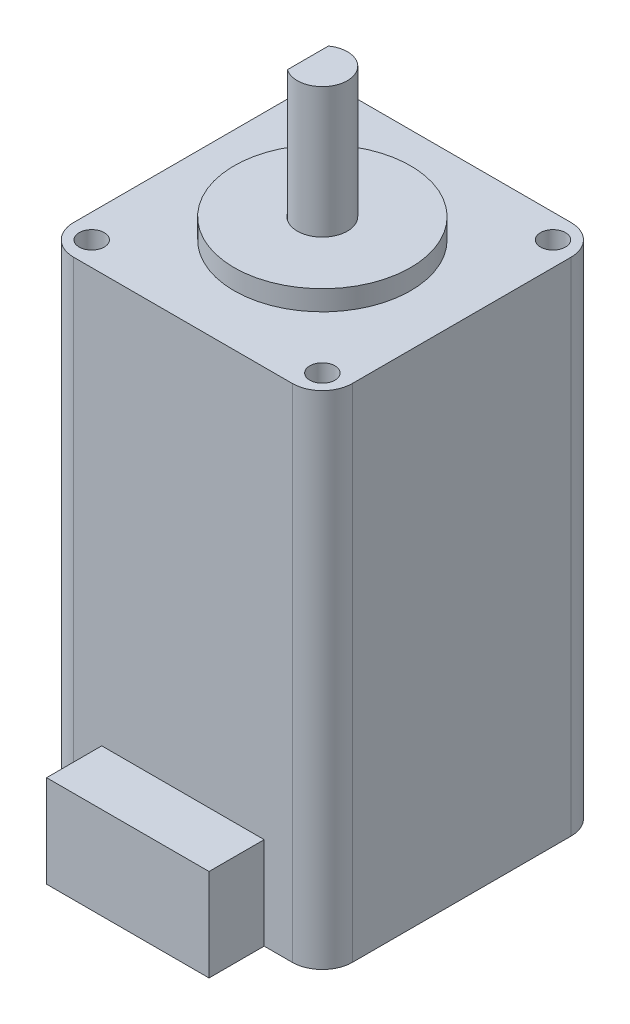
ISO-10303-21;
HEADER;
FILE_DESCRIPTION(('STEP AP214'),'2;1');
FILE_NAME('part.step','',(''),(''),'','','');
FILE_SCHEMA(('AUTOMOTIVE_DESIGN { 1 0 10303 214 1 1 1 1 }'));
ENDSEC;
DATA;
#1=APPLICATION_CONTEXT('core data for automotive mechanical design processes');
#2=APPLICATION_PROTOCOL_DEFINITION('international standard','automotive_design',2000,#1);
#3=PRODUCT_CONTEXT('',#1,'mechanical');
#4=PRODUCT('Part','Part','',(#3));
#5=PRODUCT_RELATED_PRODUCT_CATEGORY('part','',(#4));
#6=PRODUCT_DEFINITION_FORMATION('','',#4);
#7=PRODUCT_DEFINITION_CONTEXT('part definition',#1,'design');
#8=PRODUCT_DEFINITION('design','',#6,#7);
#9=PRODUCT_DEFINITION_SHAPE('','',#8);
#10=(LENGTH_UNIT() NAMED_UNIT(*) SI_UNIT(.MILLI.,.METRE.));
#11=(NAMED_UNIT(*) PLANE_ANGLE_UNIT() SI_UNIT($,.RADIAN.));
#12=(NAMED_UNIT(*) SI_UNIT($,.STERADIAN.) SOLID_ANGLE_UNIT());
#13=UNCERTAINTY_MEASURE_WITH_UNIT(LENGTH_MEASURE(1.E-05),#10,'distance_accuracy_value','');
#14=(GEOMETRIC_REPRESENTATION_CONTEXT(3) GLOBAL_UNCERTAINTY_ASSIGNED_CONTEXT((#13)) GLOBAL_UNIT_ASSIGNED_CONTEXT((#10,
#11,#12)) REPRESENTATION_CONTEXT('',''));
#15=CARTESIAN_POINT('',(0.,0.,0.));
#16=DIRECTION('',(0.,0.,1.));
#17=DIRECTION('',(1.,0.,0.));
#18=AXIS2_PLACEMENT_3D('',#15,#16,#17);
#19=CARTESIAN_POINT('',(0.,65.,0.));
#20=DIRECTION('',(0.,-1.,0.));
#21=DIRECTION('',(0.,0.,-1.));
#22=AXIS2_PLACEMENT_3D('',#19,#20,#21);
#23=CYLINDRICAL_SURFACE('',#22,2.5);
#24=DIRECTION('',(0.,1.,0.));
#25=VECTOR('',#24,1.);
#26=CARTESIAN_POINT('',(-1.4382470003859,45.,-2.04485832415866));
#27=LINE('',#26,#25);
#28=CARTESIAN_POINT('',(-1.4382470003859,52.,-2.04485832415866));
#29=VERTEX_POINT('',#28);
#30=CARTESIAN_POINT('',(-1.4382470003859,65.,-2.04485832415866));
#31=VERTEX_POINT('',#30);
#32=EDGE_CURVE('E154',#29,#31,#27,.T.);
#33=ORIENTED_EDGE('',*,*,#32,.T.);
#34=CARTESIAN_POINT('',(0.,65.,0.));
#35=DIRECTION('',(0.,1.,0.));
#36=DIRECTION('',(0.,0.,1.));
#37=AXIS2_PLACEMENT_3D('',#34,#35,#36);
#38=CIRCLE('',#37,2.5);
#39=CARTESIAN_POINT('',(-1.4382470003859,65.,2.04485832415866));
#40=VERTEX_POINT('',#39);
#41=EDGE_CURVE('E258',#40,#31,#38,.T.);
#42=ORIENTED_EDGE('',*,*,#41,.F.);
#43=DIRECTION('',(0.,1.,0.));
#44=VECTOR('',#43,1.);
#45=CARTESIAN_POINT('',(-1.4382470003859,45.,2.04485832415866));
#46=LINE('',#45,#44);
#47=CARTESIAN_POINT('',(-1.4382470003859,52.,2.04485832415866));
#48=VERTEX_POINT('',#47);
#49=EDGE_CURVE('E57',#48,#40,#46,.T.);
#50=ORIENTED_EDGE('',*,*,#49,.F.);
#51=CARTESIAN_POINT('',(0.,52.,0.));
#52=DIRECTION('',(0.,1.,0.));
#53=DIRECTION('',(0.,0.,1.));
#54=AXIS2_PLACEMENT_3D('',#51,#52,#53);
#55=CIRCLE('',#54,2.5);
#56=EDGE_CURVE('E267',#48,#29,#55,.T.);
#57=ORIENTED_EDGE('',*,*,#56,.T.);
#58=EDGE_LOOP('',(#33,#42,#50,#57));
#59=FACE_BOUND('',#58,.T.);
#60=ADVANCED_FACE('F41',(#59),#23,.T.);
#61=CARTESIAN_POINT('',(0.,65.,0.));
#62=DIRECTION('',(0.,1.,0.));
#63=DIRECTION('',(0.,0.,1.));
#64=AXIS2_PLACEMENT_3D('',#61,#62,#63);
#65=PLANE('',#64);
#66=ORIENTED_EDGE('',*,*,#41,.T.);
#67=DIRECTION('',(0.,0.,1.));
#68=VECTOR('',#67,1.);
#69=CARTESIAN_POINT('',(-1.4382470003859,65.,0.));
#70=LINE('',#69,#68);
#71=EDGE_CURVE('E165',#31,#40,#70,.T.);
#72=ORIENTED_EDGE('',*,*,#71,.T.);
#73=EDGE_LOOP('',(#66,#72));
#74=FACE_BOUND('',#73,.T.);
#75=ADVANCED_FACE('F433',(#74),#65,.T.);
#76=CARTESIAN_POINT('',(-13.9,50.,13.9));
#77=DIRECTION('',(0.,0.,-1.));
#78=DIRECTION('',(-1.,0.,0.));
#79=AXIS2_PLACEMENT_3D('',#76,#77,#78);
#80=PLANE('',#79);
#81=DIRECTION('',(1.,0.,0.));
#82=VECTOR('',#81,1.);
#83=CARTESIAN_POINT('',(-13.9,0.,13.9));
#84=LINE('',#83,#82);
#85=CARTESIAN_POINT('',(8.1,0.,13.9));
#86=VERTEX_POINT('',#85);
#87=CARTESIAN_POINT('',(10.9,0.,13.9));
#88=VERTEX_POINT('',#87);
#89=EDGE_CURVE('E303',#86,#88,#84,.T.);
#90=ORIENTED_EDGE('',*,*,#89,.T.);
#91=DIRECTION('',(0.,-1.,0.));
#92=VECTOR('',#91,1.);
#93=CARTESIAN_POINT('',(10.9,50.,13.9));
#94=LINE('',#93,#92);
#95=CARTESIAN_POINT('',(10.9,50.,13.9));
#96=VERTEX_POINT('',#95);
#97=EDGE_CURVE('E11',#88,#96,#94,.F.);
#98=ORIENTED_EDGE('',*,*,#97,.T.);
#99=DIRECTION('',(1.,0.,0.));
#100=VECTOR('',#99,1.);
#101=CARTESIAN_POINT('',(-13.9,50.,13.9));
#102=LINE('',#101,#100);
#103=CARTESIAN_POINT('',(-10.9,50.,13.9));
#104=VERTEX_POINT('',#103);
#105=EDGE_CURVE('E276',#104,#96,#102,.T.);
#106=ORIENTED_EDGE('',*,*,#105,.F.);
#107=DIRECTION('',(0.,-1.,0.));
#108=VECTOR('',#107,1.);
#109=CARTESIAN_POINT('',(-10.9,50.,13.9));
#110=LINE('',#109,#108);
#111=CARTESIAN_POINT('',(-10.9,0.,13.9));
#112=VERTEX_POINT('',#111);
#113=EDGE_CURVE('E50',#104,#112,#110,.T.);
#114=ORIENTED_EDGE('',*,*,#113,.T.);
#115=CARTESIAN_POINT('',(-8.1,0.,13.9));
#116=VERTEX_POINT('',#115);
#117=EDGE_CURVE('E282',#112,#116,#84,.T.);
#118=ORIENTED_EDGE('',*,*,#117,.T.);
#119=DIRECTION('',(0.,-1.,0.));
#120=VECTOR('',#119,1.);
#121=CARTESIAN_POINT('',(-8.1,9.2,13.9));
#122=LINE('',#121,#120);
#123=CARTESIAN_POINT('',(-8.1,9.2,13.9));
#124=VERTEX_POINT('',#123);
#125=EDGE_CURVE('E223',#124,#116,#122,.T.);
#126=ORIENTED_EDGE('',*,*,#125,.F.);
#127=DIRECTION('',(-1.,0.,0.));
#128=VECTOR('',#127,1.);
#129=CARTESIAN_POINT('',(-8.1,9.2,13.9));
#130=LINE('',#129,#128);
#131=CARTESIAN_POINT('',(8.1,9.2,13.9));
#132=VERTEX_POINT('',#131);
#133=EDGE_CURVE('E236',#132,#124,#130,.T.);
#134=ORIENTED_EDGE('',*,*,#133,.F.);
#135=DIRECTION('',(0.,1.,0.));
#136=VECTOR('',#135,1.);
#137=CARTESIAN_POINT('',(8.1,9.2,13.9));
#138=LINE('',#137,#136);
#139=EDGE_CURVE('E214',#86,#132,#138,.T.);
#140=ORIENTED_EDGE('',*,*,#139,.F.);
#141=EDGE_LOOP('',(#90,#98,#106,#114,#118,#126,#134,#140));
#142=FACE_BOUND('',#141,.T.);
#143=ADVANCED_FACE('F353',(#142),#80,.F.);
#144=CARTESIAN_POINT('',(13.9,50.,-13.9));
#145=DIRECTION('',(-1.,0.,0.));
#146=DIRECTION('',(0.,0.,1.));
#147=AXIS2_PLACEMENT_3D('',#144,#145,#146);
#148=PLANE('',#147);
#149=DIRECTION('',(0.,0.,-1.));
#150=VECTOR('',#149,1.);
#151=CARTESIAN_POINT('',(13.9,0.,-13.9));
#152=LINE('',#151,#150);
#153=CARTESIAN_POINT('',(13.9,0.,10.9));
#154=VERTEX_POINT('',#153);
#155=CARTESIAN_POINT('',(13.9,0.,-10.9));
#156=VERTEX_POINT('',#155);
#157=EDGE_CURVE('E271',#154,#156,#152,.T.);
#158=ORIENTED_EDGE('',*,*,#157,.T.);
#159=DIRECTION('',(0.,-1.,0.));
#160=VECTOR('',#159,1.);
#161=CARTESIAN_POINT('',(13.9,50.,-10.9));
#162=LINE('',#161,#160);
#163=CARTESIAN_POINT('',(13.9,50.,-10.9));
#164=VERTEX_POINT('',#163);
#165=EDGE_CURVE('E328',#156,#164,#162,.F.);
#166=ORIENTED_EDGE('',*,*,#165,.T.);
#167=DIRECTION('',(0.,0.,-1.));
#168=VECTOR('',#167,1.);
#169=CARTESIAN_POINT('',(13.9,50.,-13.9));
#170=LINE('',#169,#168);
#171=CARTESIAN_POINT('',(13.9,50.,10.9));
#172=VERTEX_POINT('',#171);
#173=EDGE_CURVE('E277',#172,#164,#170,.T.);
#174=ORIENTED_EDGE('',*,*,#173,.F.);
#175=DIRECTION('',(0.,-1.,0.));
#176=VECTOR('',#175,1.);
#177=CARTESIAN_POINT('',(13.9,50.,10.9));
#178=LINE('',#177,#176);
#179=EDGE_CURVE('E324',#172,#154,#178,.T.);
#180=ORIENTED_EDGE('',*,*,#179,.T.);
#181=EDGE_LOOP('',(#158,#166,#174,#180));
#182=FACE_BOUND('',#181,.T.);
#183=ADVANCED_FACE('F447',(#182),#148,.F.);
#184=CARTESIAN_POINT('',(-13.9,50.,-13.9));
#185=DIRECTION('',(0.,0.,1.));
#186=DIRECTION('',(1.,0.,0.));
#187=AXIS2_PLACEMENT_3D('',#184,#185,#186);
#188=PLANE('',#187);
#189=DIRECTION('',(-1.,0.,0.));
#190=VECTOR('',#189,1.);
#191=CARTESIAN_POINT('',(-13.9,50.,-13.9));
#192=LINE('',#191,#190);
#193=CARTESIAN_POINT('',(10.9,50.,-13.9));
#194=VERTEX_POINT('',#193);
#195=CARTESIAN_POINT('',(-10.9,50.,-13.9));
#196=VERTEX_POINT('',#195);
#197=EDGE_CURVE('E281',#194,#196,#192,.T.);
#198=ORIENTED_EDGE('',*,*,#197,.F.);
#199=DIRECTION('',(0.,-1.,0.));
#200=VECTOR('',#199,1.);
#201=CARTESIAN_POINT('',(10.9,50.,-13.9));
#202=LINE('',#201,#200);
#203=CARTESIAN_POINT('',(10.9,0.,-13.9));
#204=VERTEX_POINT('',#203);
#205=EDGE_CURVE('E308',#194,#204,#202,.T.);
#206=ORIENTED_EDGE('',*,*,#205,.T.);
#207=DIRECTION('',(-1.,0.,0.));
#208=VECTOR('',#207,1.);
#209=CARTESIAN_POINT('',(-13.9,0.,-13.9));
#210=LINE('',#209,#208);
#211=CARTESIAN_POINT('',(-10.9,0.,-13.9));
#212=VERTEX_POINT('',#211);
#213=EDGE_CURVE('E295',#204,#212,#210,.T.);
#214=ORIENTED_EDGE('',*,*,#213,.T.);
#215=DIRECTION('',(0.,-1.,0.));
#216=VECTOR('',#215,1.);
#217=CARTESIAN_POINT('',(-10.9,50.,-13.9));
#218=LINE('',#217,#216);
#219=EDGE_CURVE('E266',#212,#196,#218,.F.);
#220=ORIENTED_EDGE('',*,*,#219,.T.);
#221=EDGE_LOOP('',(#198,#206,#214,#220));
#222=FACE_BOUND('',#221,.T.);
#223=ADVANCED_FACE('F412',(#222),#188,.F.);
#224=CARTESIAN_POINT('',(-13.9,50.,-13.9));
#225=DIRECTION('',(1.,0.,0.));
#226=DIRECTION('',(0.,0.,-1.));
#227=AXIS2_PLACEMENT_3D('',#224,#225,#226);
#228=PLANE('',#227);
#229=DIRECTION('',(0.,0.,1.));
#230=VECTOR('',#229,1.);
#231=CARTESIAN_POINT('',(-13.9,50.,-13.9));
#232=LINE('',#231,#230);
#233=CARTESIAN_POINT('',(-13.9,50.,-10.9));
#234=VERTEX_POINT('',#233);
#235=CARTESIAN_POINT('',(-13.9,50.,10.9));
#236=VERTEX_POINT('',#235);
#237=EDGE_CURVE('E286',#234,#236,#232,.T.);
#238=ORIENTED_EDGE('',*,*,#237,.F.);
#239=DIRECTION('',(0.,-1.,0.));
#240=VECTOR('',#239,1.);
#241=CARTESIAN_POINT('',(-13.9,50.,-10.9));
#242=LINE('',#241,#240);
#243=CARTESIAN_POINT('',(-13.9,0.,-10.9));
#244=VERTEX_POINT('',#243);
#245=EDGE_CURVE('E346',#234,#244,#242,.T.);
#246=ORIENTED_EDGE('',*,*,#245,.T.);
#247=DIRECTION('',(0.,0.,1.));
#248=VECTOR('',#247,1.);
#249=CARTESIAN_POINT('',(-13.9,0.,-13.9));
#250=LINE('',#249,#248);
#251=CARTESIAN_POINT('',(-13.9,0.,10.9));
#252=VERTEX_POINT('',#251);
#253=EDGE_CURVE('E299',#244,#252,#250,.T.);
#254=ORIENTED_EDGE('',*,*,#253,.T.);
#255=DIRECTION('',(0.,-1.,0.));
#256=VECTOR('',#255,1.);
#257=CARTESIAN_POINT('',(-13.9,50.,10.9));
#258=LINE('',#257,#256);
#259=EDGE_CURVE('E343',#252,#236,#258,.F.);
#260=ORIENTED_EDGE('',*,*,#259,.T.);
#261=EDGE_LOOP('',(#238,#246,#254,#260));
#262=FACE_BOUND('',#261,.T.);
#263=ADVANCED_FACE('F398',(#262),#228,.F.);
#264=CARTESIAN_POINT('',(0.,50.,0.));
#265=DIRECTION('',(0.,1.,0.));
#266=DIRECTION('',(0.,0.,1.));
#267=AXIS2_PLACEMENT_3D('',#264,#265,#266);
#268=PLANE('',#267);
#269=CARTESIAN_POINT('',(-11.4999999999988,50.,11.5000000000004));
#270=DIRECTION('',(0.,1.,0.));
#271=DIRECTION('',(0.,0.,1.));
#272=AXIS2_PLACEMENT_3D('',#269,#270,#271);
#273=CIRCLE('',#272,1.25);
#274=CARTESIAN_POINT('',(-11.4999999999988,50.,12.7500000000004));
#275=VERTEX_POINT('',#274);
#276=EDGE_CURVE('E182',#275,#275,#273,.T.);
#277=ORIENTED_EDGE('',*,*,#276,.F.);
#278=EDGE_LOOP('',(#277));
#279=FACE_BOUND('',#278,.T.);
#280=CARTESIAN_POINT('',(11.5000000000012,50.,11.4999999999996));
#281=DIRECTION('',(0.,1.,0.));
#282=DIRECTION('',(0.,0.,1.));
#283=AXIS2_PLACEMENT_3D('',#280,#281,#282);
#284=CIRCLE('',#283,1.25);
#285=CARTESIAN_POINT('',(11.5000000000012,50.,12.7499999999996));
#286=VERTEX_POINT('',#285);
#287=EDGE_CURVE('E199',#286,#286,#284,.T.);
#288=ORIENTED_EDGE('',*,*,#287,.F.);
#289=EDGE_LOOP('',(#288));
#290=FACE_BOUND('',#289,.T.);
#291=CARTESIAN_POINT('',(11.5000000000004,50.,-11.5000000000004));
#292=DIRECTION('',(0.,1.,0.));
#293=DIRECTION('',(0.,0.,1.));
#294=AXIS2_PLACEMENT_3D('',#291,#292,#293);
#295=CIRCLE('',#294,1.25);
#296=CARTESIAN_POINT('',(11.5000000000004,50.,-10.2500000000004));
#297=VERTEX_POINT('',#296);
#298=EDGE_CURVE('E191',#297,#297,#295,.T.);
#299=ORIENTED_EDGE('',*,*,#298,.F.);
#300=EDGE_LOOP('',(#299));
#301=FACE_BOUND('',#300,.T.);
#302=CARTESIAN_POINT('',(-11.4999999999996,50.,-11.4999999999996));
#303=DIRECTION('',(0.,1.,0.));
#304=DIRECTION('',(0.,0.,1.));
#305=AXIS2_PLACEMENT_3D('',#302,#303,#304);
#306=CIRCLE('',#305,1.25);
#307=CARTESIAN_POINT('',(-11.4999999999996,50.,-10.2499999999996));
#308=VERTEX_POINT('',#307);
#309=EDGE_CURVE('E190',#308,#308,#306,.T.);
#310=ORIENTED_EDGE('',*,*,#309,.F.);
#311=EDGE_LOOP('',(#310));
#312=FACE_BOUND('',#311,.T.);
#313=CARTESIAN_POINT('',(0.,50.,0.));
#314=DIRECTION('',(0.,1.,0.));
#315=DIRECTION('',(0.,0.,1.));
#316=AXIS2_PLACEMENT_3D('',#313,#314,#315);
#317=CIRCLE('',#316,8.8);
#318=CARTESIAN_POINT('',(0.,50.,8.8));
#319=VERTEX_POINT('',#318);
#320=EDGE_CURVE('E272',#319,#319,#317,.T.);
#321=ORIENTED_EDGE('',*,*,#320,.F.);
#322=EDGE_LOOP('',(#321));
#323=FACE_BOUND('',#322,.T.);
#324=ORIENTED_EDGE('',*,*,#173,.T.);
#325=CARTESIAN_POINT('',(10.9,50.,-10.9));
#326=DIRECTION('',(0.,1.,0.));
#327=DIRECTION('',(0.,0.,1.));
#328=AXIS2_PLACEMENT_3D('',#325,#326,#327);
#329=CIRCLE('',#328,3.);
#330=EDGE_CURVE('E340',#164,#194,#329,.T.);
#331=ORIENTED_EDGE('',*,*,#330,.T.);
#332=ORIENTED_EDGE('',*,*,#197,.T.);
#333=CARTESIAN_POINT('',(-10.9,50.,-10.9));
#334=DIRECTION('',(0.,1.,0.));
#335=DIRECTION('',(0.,0.,1.));
#336=AXIS2_PLACEMENT_3D('',#333,#334,#335);
#337=CIRCLE('',#336,3.);
#338=EDGE_CURVE('E337',#196,#234,#337,.T.);
#339=ORIENTED_EDGE('',*,*,#338,.T.);
#340=ORIENTED_EDGE('',*,*,#237,.T.);
#341=CARTESIAN_POINT('',(-10.9,50.,10.9));
#342=DIRECTION('',(0.,1.,0.));
#343=DIRECTION('',(0.,0.,1.));
#344=AXIS2_PLACEMENT_3D('',#341,#342,#343);
#345=CIRCLE('',#344,3.);
#346=EDGE_CURVE('E331',#236,#104,#345,.T.);
#347=ORIENTED_EDGE('',*,*,#346,.T.);
#348=ORIENTED_EDGE('',*,*,#105,.T.);
#349=CARTESIAN_POINT('',(10.9,50.,10.9));
#350=DIRECTION('',(0.,1.,0.));
#351=DIRECTION('',(0.,0.,1.));
#352=AXIS2_PLACEMENT_3D('',#349,#350,#351);
#353=CIRCLE('',#352,3.);
#354=EDGE_CURVE('E334',#96,#172,#353,.T.);
#355=ORIENTED_EDGE('',*,*,#354,.T.);
#356=EDGE_LOOP('',(#324,#331,#332,#339,#340,#347,#348,#355));
#357=FACE_BOUND('',#356,.T.);
#358=ADVANCED_FACE('F395',(#279,#290,#301,#312,#323,#357),#268,.T.);
#359=CARTESIAN_POINT('',(0.,0.,0.));
#360=DIRECTION('',(0.,1.,0.));
#361=DIRECTION('',(0.,0.,1.));
#362=AXIS2_PLACEMENT_3D('',#359,#360,#361);
#363=PLANE('',#362);
#364=CARTESIAN_POINT('',(0.,0.,0.));
#365=DIRECTION('',(0.,-1.,0.));
#366=DIRECTION('',(0.,0.,-1.));
#367=AXIS2_PLACEMENT_3D('',#364,#365,#366);
#368=CIRCLE('',#367,4.);
#369=CARTESIAN_POINT('',(0.,0.,-4.));
#370=VERTEX_POINT('',#369);
#371=EDGE_CURVE('E176',#370,#370,#368,.T.);
#372=ORIENTED_EDGE('',*,*,#371,.F.);
#373=EDGE_LOOP('',(#372));
#374=FACE_BOUND('',#373,.T.);
#375=ORIENTED_EDGE('',*,*,#213,.F.);
#376=CARTESIAN_POINT('',(10.9,0.,-10.9));
#377=DIRECTION('',(0.,1.,0.));
#378=DIRECTION('',(0.,0.,1.));
#379=AXIS2_PLACEMENT_3D('',#376,#377,#378);
#380=CIRCLE('',#379,3.);
#381=EDGE_CURVE('E321',#204,#156,#380,.F.);
#382=ORIENTED_EDGE('',*,*,#381,.T.);
#383=ORIENTED_EDGE('',*,*,#157,.F.);
#384=CARTESIAN_POINT('',(10.9,0.,10.9));
#385=DIRECTION('',(0.,1.,0.));
#386=DIRECTION('',(0.,0.,1.));
#387=AXIS2_PLACEMENT_3D('',#384,#385,#386);
#388=CIRCLE('',#387,3.);
#389=EDGE_CURVE('E315',#154,#88,#388,.F.);
#390=ORIENTED_EDGE('',*,*,#389,.T.);
#391=ORIENTED_EDGE('',*,*,#89,.F.);
#392=DIRECTION('',(0.,0.,-1.));
#393=VECTOR('',#392,1.);
#394=CARTESIAN_POINT('',(8.1,0.,19.4));
#395=LINE('',#394,#393);
#396=CARTESIAN_POINT('',(8.1,0.,19.4));
#397=VERTEX_POINT('',#396);
#398=EDGE_CURVE('E232',#397,#86,#395,.T.);
#399=ORIENTED_EDGE('',*,*,#398,.F.);
#400=DIRECTION('',(1.,0.,0.));
#401=VECTOR('',#400,1.);
#402=CARTESIAN_POINT('',(-8.1,0.,19.4));
#403=LINE('',#402,#401);
#404=CARTESIAN_POINT('',(-8.1,0.,19.4));
#405=VERTEX_POINT('',#404);
#406=EDGE_CURVE('E229',#405,#397,#403,.T.);
#407=ORIENTED_EDGE('',*,*,#406,.F.);
#408=DIRECTION('',(0.,0.,-1.));
#409=VECTOR('',#408,1.);
#410=CARTESIAN_POINT('',(-8.1,0.,19.4));
#411=LINE('',#410,#409);
#412=EDGE_CURVE('E246',#405,#116,#411,.T.);
#413=ORIENTED_EDGE('',*,*,#412,.T.);
#414=ORIENTED_EDGE('',*,*,#117,.F.);
#415=CARTESIAN_POINT('',(-10.9,0.,10.9));
#416=DIRECTION('',(0.,1.,0.));
#417=DIRECTION('',(0.,0.,1.));
#418=AXIS2_PLACEMENT_3D('',#415,#416,#417);
#419=CIRCLE('',#418,3.);
#420=EDGE_CURVE('E312',#112,#252,#419,.F.);
#421=ORIENTED_EDGE('',*,*,#420,.T.);
#422=ORIENTED_EDGE('',*,*,#253,.F.);
#423=CARTESIAN_POINT('',(-10.9,0.,-10.9));
#424=DIRECTION('',(0.,1.,0.));
#425=DIRECTION('',(0.,0.,1.));
#426=AXIS2_PLACEMENT_3D('',#423,#424,#425);
#427=CIRCLE('',#426,3.);
#428=EDGE_CURVE('E318',#244,#212,#427,.F.);
#429=ORIENTED_EDGE('',*,*,#428,.T.);
#430=EDGE_LOOP('',(#375,#382,#383,#390,#391,#399,#407,#413,#414,#421,#422,#429));
#431=FACE_BOUND('',#430,.T.);
#432=ADVANCED_FACE('F358',(#374,#431),#363,.F.);
#433=CARTESIAN_POINT('',(0.,52.,0.));
#434=DIRECTION('',(0.,-1.,0.));
#435=DIRECTION('',(0.,0.,-1.));
#436=AXIS2_PLACEMENT_3D('',#433,#434,#435);
#437=CYLINDRICAL_SURFACE('',#436,8.8);
#438=CARTESIAN_POINT('',(0.,52.,0.));
#439=DIRECTION('',(0.,1.,0.));
#440=DIRECTION('',(0.,0.,1.));
#441=AXIS2_PLACEMENT_3D('',#438,#439,#440);
#442=CIRCLE('',#441,8.8);
#443=CARTESIAN_POINT('',(0.,52.,8.8));
#444=VERTEX_POINT('',#443);
#445=EDGE_CURVE('E262',#444,#444,#442,.T.);
#446=ORIENTED_EDGE('',*,*,#445,.F.);
#447=EDGE_LOOP('',(#446));
#448=FACE_BOUND('',#447,.T.);
#449=ORIENTED_EDGE('',*,*,#320,.T.);
#450=EDGE_LOOP('',(#449));
#451=FACE_BOUND('',#450,.T.);
#452=ADVANCED_FACE('F386',(#448,#451),#437,.T.);
#453=CARTESIAN_POINT('',(0.,52.,0.));
#454=DIRECTION('',(0.,1.,0.));
#455=DIRECTION('',(0.,0.,1.));
#456=AXIS2_PLACEMENT_3D('',#453,#454,#455);
#457=PLANE('',#456);
#458=EDGE_CURVE('E263',#29,#48,#55,.T.);
#459=ORIENTED_EDGE('',*,*,#458,.F.);
#460=ORIENTED_EDGE('',*,*,#56,.F.);
#461=EDGE_LOOP('',(#459,#460));
#462=FACE_BOUND('',#461,.T.);
#463=ORIENTED_EDGE('',*,*,#445,.T.);
#464=EDGE_LOOP('',(#463));
#465=FACE_BOUND('',#464,.T.);
#466=ADVANCED_FACE('F383',(#462,#465),#457,.T.);
#467=CARTESIAN_POINT('',(8.1,9.2,19.4));
#468=DIRECTION('',(-1.,0.,0.));
#469=DIRECTION('',(0.,0.,1.));
#470=AXIS2_PLACEMENT_3D('',#467,#468,#469);
#471=PLANE('',#470);
#472=ORIENTED_EDGE('',*,*,#139,.T.);
#473=DIRECTION('',(0.,0.,-1.));
#474=VECTOR('',#473,1.);
#475=CARTESIAN_POINT('',(8.1,9.2,19.4));
#476=LINE('',#475,#474);
#477=CARTESIAN_POINT('',(8.1,9.2,19.4));
#478=VERTEX_POINT('',#477);
#479=EDGE_CURVE('E254',#478,#132,#476,.T.);
#480=ORIENTED_EDGE('',*,*,#479,.F.);
#481=DIRECTION('',(0.,1.,0.));
#482=VECTOR('',#481,1.);
#483=CARTESIAN_POINT('',(8.1,9.2,19.4));
#484=LINE('',#483,#482);
#485=EDGE_CURVE('E218',#397,#478,#484,.T.);
#486=ORIENTED_EDGE('',*,*,#485,.F.);
#487=ORIENTED_EDGE('',*,*,#398,.T.);
#488=EDGE_LOOP('',(#472,#480,#486,#487));
#489=FACE_BOUND('',#488,.T.);
#490=ADVANCED_FACE('F372',(#489),#471,.F.);
#491=CARTESIAN_POINT('',(-8.1,9.2,19.4));
#492=DIRECTION('',(0.,-1.,0.));
#493=DIRECTION('',(0.,0.,-1.));
#494=AXIS2_PLACEMENT_3D('',#491,#492,#493);
#495=PLANE('',#494);
#496=ORIENTED_EDGE('',*,*,#133,.T.);
#497=DIRECTION('',(0.,0.,-1.));
#498=VECTOR('',#497,1.);
#499=CARTESIAN_POINT('',(-8.1,9.2,19.4));
#500=LINE('',#499,#498);
#501=CARTESIAN_POINT('',(-8.1,9.2,19.4));
#502=VERTEX_POINT('',#501);
#503=EDGE_CURVE('E250',#502,#124,#500,.T.);
#504=ORIENTED_EDGE('',*,*,#503,.F.);
#505=DIRECTION('',(-1.,0.,0.));
#506=VECTOR('',#505,1.);
#507=CARTESIAN_POINT('',(-8.1,9.2,19.4));
#508=LINE('',#507,#506);
#509=EDGE_CURVE('E222',#478,#502,#508,.T.);
#510=ORIENTED_EDGE('',*,*,#509,.F.);
#511=ORIENTED_EDGE('',*,*,#479,.T.);
#512=EDGE_LOOP('',(#496,#504,#510,#511));
#513=FACE_BOUND('',#512,.T.);
#514=ADVANCED_FACE('F368',(#513),#495,.F.);
#515=CARTESIAN_POINT('',(-8.1,9.2,19.4));
#516=DIRECTION('',(1.,0.,0.));
#517=DIRECTION('',(0.,1.,0.));
#518=AXIS2_PLACEMENT_3D('',#515,#516,#517);
#519=PLANE('',#518);
#520=ORIENTED_EDGE('',*,*,#125,.T.);
#521=ORIENTED_EDGE('',*,*,#412,.F.);
#522=DIRECTION('',(0.,-1.,0.));
#523=VECTOR('',#522,1.);
#524=CARTESIAN_POINT('',(-8.1,9.2,19.4));
#525=LINE('',#524,#523);
#526=EDGE_CURVE('E226',#502,#405,#525,.T.);
#527=ORIENTED_EDGE('',*,*,#526,.F.);
#528=ORIENTED_EDGE('',*,*,#503,.T.);
#529=EDGE_LOOP('',(#520,#521,#527,#528));
#530=FACE_BOUND('',#529,.T.);
#531=ADVANCED_FACE('F365',(#530),#519,.F.);
#532=CARTESIAN_POINT('',(0.,0.,19.4));
#533=DIRECTION('',(0.,0.,1.));
#534=DIRECTION('',(1.,0.,0.));
#535=AXIS2_PLACEMENT_3D('',#532,#533,#534);
#536=PLANE('',#535);
#537=ORIENTED_EDGE('',*,*,#485,.T.);
#538=ORIENTED_EDGE('',*,*,#509,.T.);
#539=ORIENTED_EDGE('',*,*,#526,.T.);
#540=ORIENTED_EDGE('',*,*,#406,.T.);
#541=EDGE_LOOP('',(#537,#538,#539,#540));
#542=FACE_BOUND('',#541,.T.);
#543=ADVANCED_FACE('F594',(#542),#536,.T.);
#544=CARTESIAN_POINT('',(-11.4999999999996,45.,-11.4999999999996));
#545=DIRECTION('',(0.,1.,0.));
#546=DIRECTION('',(0.,0.,1.));
#547=AXIS2_PLACEMENT_3D('',#544,#545,#546);
#548=CYLINDRICAL_SURFACE('',#547,1.25);
#549=CARTESIAN_POINT('',(-11.4999999999996,45.,-11.4999999999996));
#550=DIRECTION('',(0.,1.,0.));
#551=DIRECTION('',(0.,0.,1.));
#552=AXIS2_PLACEMENT_3D('',#549,#550,#551);
#553=CIRCLE('',#552,1.25);
#554=CARTESIAN_POINT('',(-11.4999999999996,45.,-10.2499999999996));
#555=VERTEX_POINT('',#554);
#556=EDGE_CURVE('E210',#555,#555,#553,.T.);
#557=ORIENTED_EDGE('',*,*,#556,.F.);
#558=EDGE_LOOP('',(#557));
#559=FACE_BOUND('',#558,.T.);
#560=ORIENTED_EDGE('',*,*,#309,.T.);
#561=EDGE_LOOP('',(#560));
#562=FACE_BOUND('',#561,.T.);
#563=ADVANCED_FACE('F603',(#559,#562),#548,.F.);
#564=CARTESIAN_POINT('',(-11.4999999999996,45.,-11.4999999999996));
#565=DIRECTION('',(0.,1.,0.));
#566=DIRECTION('',(0.,0.,1.));
#567=AXIS2_PLACEMENT_3D('',#564,#565,#566);
#568=PLANE('',#567);
#569=ORIENTED_EDGE('',*,*,#556,.T.);
#570=EDGE_LOOP('',(#569));
#571=FACE_BOUND('',#570,.T.);
#572=ADVANCED_FACE('F613',(#571),#568,.T.);
#573=CARTESIAN_POINT('',(11.5000000000004,45.,-11.5000000000004));
#574=DIRECTION('',(0.,1.,0.));
#575=DIRECTION('',(0.,0.,1.));
#576=AXIS2_PLACEMENT_3D('',#573,#574,#575);
#577=CYLINDRICAL_SURFACE('',#576,1.25);
#578=CARTESIAN_POINT('',(11.5000000000004,45.,-11.5000000000004));
#579=DIRECTION('',(0.,1.,0.));
#580=DIRECTION('',(0.,0.,1.));
#581=AXIS2_PLACEMENT_3D('',#578,#579,#580);
#582=CIRCLE('',#581,1.25);
#583=CARTESIAN_POINT('',(11.5000000000004,45.,-10.2500000000004));
#584=VERTEX_POINT('',#583);
#585=EDGE_CURVE('E186',#584,#584,#582,.T.);
#586=ORIENTED_EDGE('',*,*,#585,.F.);
#587=EDGE_LOOP('',(#586));
#588=FACE_BOUND('',#587,.T.);
#589=ORIENTED_EDGE('',*,*,#298,.T.);
#590=EDGE_LOOP('',(#589));
#591=FACE_BOUND('',#590,.T.);
#592=ADVANCED_FACE('F623',(#588,#591),#577,.F.);
#593=CARTESIAN_POINT('',(11.5000000000004,45.,-11.5000000000004));
#594=DIRECTION('',(0.,1.,0.));
#595=DIRECTION('',(0.,0.,1.));
#596=AXIS2_PLACEMENT_3D('',#593,#594,#595);
#597=PLANE('',#596);
#598=ORIENTED_EDGE('',*,*,#585,.T.);
#599=EDGE_LOOP('',(#598));
#600=FACE_BOUND('',#599,.T.);
#601=ADVANCED_FACE('F633',(#600),#597,.T.);
#602=CARTESIAN_POINT('',(11.5000000000012,45.,11.4999999999996));
#603=DIRECTION('',(0.,1.,0.));
#604=DIRECTION('',(0.,0.,1.));
#605=AXIS2_PLACEMENT_3D('',#602,#603,#604);
#606=CYLINDRICAL_SURFACE('',#605,1.25);
#607=CARTESIAN_POINT('',(11.5000000000012,45.,11.4999999999996));
#608=DIRECTION('',(0.,1.,0.));
#609=DIRECTION('',(0.,0.,1.));
#610=AXIS2_PLACEMENT_3D('',#607,#608,#609);
#611=CIRCLE('',#610,1.25);
#612=CARTESIAN_POINT('',(11.5000000000012,45.,12.7499999999996));
#613=VERTEX_POINT('',#612);
#614=EDGE_CURVE('E195',#613,#613,#611,.T.);
#615=ORIENTED_EDGE('',*,*,#614,.F.);
#616=EDGE_LOOP('',(#615));
#617=FACE_BOUND('',#616,.T.);
#618=ORIENTED_EDGE('',*,*,#287,.T.);
#619=EDGE_LOOP('',(#618));
#620=FACE_BOUND('',#619,.T.);
#621=ADVANCED_FACE('F643',(#617,#620),#606,.F.);
#622=CARTESIAN_POINT('',(11.5000000000012,45.,11.4999999999996));
#623=DIRECTION('',(0.,1.,0.));
#624=DIRECTION('',(0.,0.,1.));
#625=AXIS2_PLACEMENT_3D('',#622,#623,#624);
#626=PLANE('',#625);
#627=ORIENTED_EDGE('',*,*,#614,.T.);
#628=EDGE_LOOP('',(#627));
#629=FACE_BOUND('',#628,.T.);
#630=ADVANCED_FACE('F653',(#629),#626,.T.);
#631=CARTESIAN_POINT('',(-11.4999999999988,45.,11.5000000000004));
#632=DIRECTION('',(0.,1.,0.));
#633=DIRECTION('',(0.,0.,1.));
#634=AXIS2_PLACEMENT_3D('',#631,#632,#633);
#635=CYLINDRICAL_SURFACE('',#634,1.25);
#636=CARTESIAN_POINT('',(-11.4999999999988,45.,11.5000000000004));
#637=DIRECTION('',(0.,1.,0.));
#638=DIRECTION('',(0.,0.,1.));
#639=AXIS2_PLACEMENT_3D('',#636,#637,#638);
#640=CIRCLE('',#639,1.25);
#641=CARTESIAN_POINT('',(-11.4999999999988,45.,12.7500000000004));
#642=VERTEX_POINT('',#641);
#643=EDGE_CURVE('E203',#642,#642,#640,.T.);
#644=ORIENTED_EDGE('',*,*,#643,.F.);
#645=EDGE_LOOP('',(#644));
#646=FACE_BOUND('',#645,.T.);
#647=ORIENTED_EDGE('',*,*,#276,.T.);
#648=EDGE_LOOP('',(#647));
#649=FACE_BOUND('',#648,.T.);
#650=ADVANCED_FACE('F663',(#646,#649),#635,.F.);
#651=CARTESIAN_POINT('',(-11.4999999999988,45.,11.5000000000004));
#652=DIRECTION('',(0.,1.,0.));
#653=DIRECTION('',(0.,0.,1.));
#654=AXIS2_PLACEMENT_3D('',#651,#652,#653);
#655=PLANE('',#654);
#656=ORIENTED_EDGE('',*,*,#643,.T.);
#657=EDGE_LOOP('',(#656));
#658=FACE_BOUND('',#657,.T.);
#659=ADVANCED_FACE('F456',(#658),#655,.T.);
#660=CARTESIAN_POINT('',(10.9,50.,-10.9));
#661=DIRECTION('',(0.,-1.,0.));
#662=DIRECTION('',(0.,0.,-1.));
#663=AXIS2_PLACEMENT_3D('',#660,#661,#662);
#664=CYLINDRICAL_SURFACE('',#663,3.);
#665=ORIENTED_EDGE('',*,*,#330,.F.);
#666=ORIENTED_EDGE('',*,*,#165,.F.);
#667=ORIENTED_EDGE('',*,*,#381,.F.);
#668=ORIENTED_EDGE('',*,*,#205,.F.);
#669=EDGE_LOOP('',(#665,#666,#667,#668));
#670=FACE_BOUND('',#669,.T.);
#671=ADVANCED_FACE('F410',(#670),#664,.T.);
#672=CARTESIAN_POINT('',(-10.9,50.,-10.9));
#673=DIRECTION('',(0.,-1.,0.));
#674=DIRECTION('',(0.,0.,-1.));
#675=AXIS2_PLACEMENT_3D('',#672,#673,#674);
#676=CYLINDRICAL_SURFACE('',#675,3.);
#677=ORIENTED_EDGE('',*,*,#338,.F.);
#678=ORIENTED_EDGE('',*,*,#219,.F.);
#679=ORIENTED_EDGE('',*,*,#428,.F.);
#680=ORIENTED_EDGE('',*,*,#245,.F.);
#681=EDGE_LOOP('',(#677,#678,#679,#680));
#682=FACE_BOUND('',#681,.T.);
#683=ADVANCED_FACE('F417',(#682),#676,.T.);
#684=CARTESIAN_POINT('',(10.9,50.,10.9));
#685=DIRECTION('',(0.,-1.,0.));
#686=DIRECTION('',(0.,0.,-1.));
#687=AXIS2_PLACEMENT_3D('',#684,#685,#686);
#688=CYLINDRICAL_SURFACE('',#687,3.);
#689=ORIENTED_EDGE('',*,*,#354,.F.);
#690=ORIENTED_EDGE('',*,*,#97,.F.);
#691=ORIENTED_EDGE('',*,*,#389,.F.);
#692=ORIENTED_EDGE('',*,*,#179,.F.);
#693=EDGE_LOOP('',(#689,#690,#691,#692));
#694=FACE_BOUND('',#693,.T.);
#695=ADVANCED_FACE('F423',(#694),#688,.T.);
#696=CARTESIAN_POINT('',(-10.9,50.,10.9));
#697=DIRECTION('',(0.,-1.,0.));
#698=DIRECTION('',(0.,0.,-1.));
#699=AXIS2_PLACEMENT_3D('',#696,#697,#698);
#700=CYLINDRICAL_SURFACE('',#699,3.);
#701=ORIENTED_EDGE('',*,*,#346,.F.);
#702=ORIENTED_EDGE('',*,*,#259,.F.);
#703=ORIENTED_EDGE('',*,*,#420,.F.);
#704=ORIENTED_EDGE('',*,*,#113,.F.);
#705=EDGE_LOOP('',(#701,#702,#703,#704));
#706=FACE_BOUND('',#705,.T.);
#707=ADVANCED_FACE('F43',(#706),#700,.T.);
#708=CARTESIAN_POINT('',(0.,5.,0.));
#709=DIRECTION('',(0.,-1.,0.));
#710=DIRECTION('',(0.,0.,-1.));
#711=AXIS2_PLACEMENT_3D('',#708,#709,#710);
#712=CYLINDRICAL_SURFACE('',#711,4.);
#713=CARTESIAN_POINT('',(0.,5.,0.));
#714=DIRECTION('',(0.,-1.,0.));
#715=DIRECTION('',(0.,0.,-1.));
#716=AXIS2_PLACEMENT_3D('',#713,#714,#715);
#717=CIRCLE('',#716,4.);
#718=CARTESIAN_POINT('',(0.,5.,-4.));
#719=VERTEX_POINT('',#718);
#720=EDGE_CURVE('E178',#719,#719,#717,.T.);
#721=ORIENTED_EDGE('',*,*,#720,.F.);
#722=EDGE_LOOP('',(#721));
#723=FACE_BOUND('',#722,.T.);
#724=ORIENTED_EDGE('',*,*,#371,.T.);
#725=EDGE_LOOP('',(#724));
#726=FACE_BOUND('',#725,.T.);
#727=ADVANCED_FACE('F422',(#723,#726),#712,.F.);
#728=CARTESIAN_POINT('',(0.,5.,0.));
#729=DIRECTION('',(0.,-1.,0.));
#730=DIRECTION('',(0.,0.,-1.));
#731=AXIS2_PLACEMENT_3D('',#728,#729,#730);
#732=PLANE('',#731);
#733=ORIENTED_EDGE('',*,*,#720,.T.);
#734=EDGE_LOOP('',(#733));
#735=FACE_BOUND('',#734,.T.);
#736=ADVANCED_FACE('F428',(#735),#732,.T.);
#737=CARTESIAN_POINT('',(-1.4382470003859,45.,0.));
#738=DIRECTION('',(-1.,0.,0.));
#739=DIRECTION('',(0.,0.,1.));
#740=AXIS2_PLACEMENT_3D('',#737,#738,#739);
#741=PLANE('',#740);
#742=ORIENTED_EDGE('',*,*,#71,.F.);
#743=ORIENTED_EDGE('',*,*,#32,.F.);
#744=CARTESIAN_POINT('',(-1.4382470003859,45.,-2.04485832415866));
#745=VERTEX_POINT('',#744);
#746=EDGE_CURVE('E148',#745,#29,#27,.T.);
#747=ORIENTED_EDGE('',*,*,#746,.F.);
#748=DIRECTION('',(0.,0.,1.));
#749=VECTOR('',#748,1.);
#750=CARTESIAN_POINT('',(-1.4382470003859,45.,0.));
#751=LINE('',#750,#749);
#752=CARTESIAN_POINT('',(-1.4382470003859,45.,2.04485832415866));
#753=VERTEX_POINT('',#752);
#754=EDGE_CURVE('E151',#745,#753,#751,.T.);
#755=ORIENTED_EDGE('',*,*,#754,.T.);
#756=EDGE_CURVE('E168',#753,#48,#46,.T.);
#757=ORIENTED_EDGE('',*,*,#756,.T.);
#758=ORIENTED_EDGE('',*,*,#49,.T.);
#759=EDGE_LOOP('',(#742,#743,#747,#755,#757,#758));
#760=FACE_BOUND('',#759,.T.);
#761=ADVANCED_FACE('F150',(#760),#741,.T.);
#762=CARTESIAN_POINT('',(0.,45.,0.));
#763=DIRECTION('',(0.,1.,0.));
#764=DIRECTION('',(0.,0.,1.));
#765=AXIS2_PLACEMENT_3D('',#762,#763,#764);
#766=CYLINDRICAL_SURFACE('',#765,2.5);
#767=ORIENTED_EDGE('',*,*,#458,.T.);
#768=ORIENTED_EDGE('',*,*,#756,.F.);
#769=CARTESIAN_POINT('',(0.,45.,0.));
#770=DIRECTION('',(0.,1.,0.));
#771=DIRECTION('',(0.,0.,1.));
#772=AXIS2_PLACEMENT_3D('',#769,#770,#771);
#773=CIRCLE('',#772,2.5);
#774=EDGE_CURVE('E163',#745,#753,#773,.T.);
#775=ORIENTED_EDGE('',*,*,#774,.F.);
#776=ORIENTED_EDGE('',*,*,#746,.T.);
#777=EDGE_LOOP('',(#767,#768,#775,#776));
#778=FACE_BOUND('',#777,.T.);
#779=ADVANCED_FACE('F167',(#778),#766,.F.);
#780=CARTESIAN_POINT('',(0.,45.,0.));
#781=DIRECTION('',(0.,1.,0.));
#782=DIRECTION('',(0.,0.,1.));
#783=AXIS2_PLACEMENT_3D('',#780,#781,#782);
#784=PLANE('',#783);
#785=ORIENTED_EDGE('',*,*,#754,.F.);
#786=ORIENTED_EDGE('',*,*,#774,.T.);
#787=EDGE_LOOP('',(#785,#786));
#788=FACE_BOUND('',#787,.T.);
#789=ADVANCED_FACE('F162',(#788),#784,.T.);
#790=CLOSED_SHELL('',(#60,#75,#143,#183,#223,#263,#358,#432,#452,#466,#490,#514,#531,#543,#563,
#572,#592,#601,#621,#630,#650,#659,#671,#683,#695,#707,#727,#736,#761,#779,#789));
#791=MANIFOLD_SOLID_BREP('B2',#790);
#792=ADVANCED_BREP_SHAPE_REPRESENTATION('',(#18,#791),#14);
#793=SHAPE_DEFINITION_REPRESENTATION(#9,#792);
ENDSEC;
END-ISO-10303-21;
